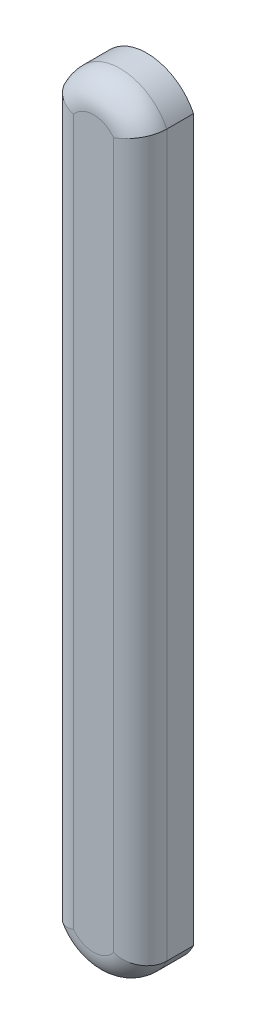
ISO-10303-21;
HEADER;
FILE_DESCRIPTION(('STEP AP214'),'2;1');
FILE_NAME('part.step','',(''),(''),'','','');
FILE_SCHEMA(('AUTOMOTIVE_DESIGN { 1 0 10303 214 1 1 1 1 }'));
ENDSEC;
DATA;
#1=APPLICATION_CONTEXT('core data for automotive mechanical design processes');
#2=APPLICATION_PROTOCOL_DEFINITION('international standard','automotive_design',2000,#1);
#3=PRODUCT_CONTEXT('',#1,'mechanical');
#4=PRODUCT('Part','Part','',(#3));
#5=PRODUCT_RELATED_PRODUCT_CATEGORY('part','',(#4));
#6=PRODUCT_DEFINITION_FORMATION('','',#4);
#7=PRODUCT_DEFINITION_CONTEXT('part definition',#1,'design');
#8=PRODUCT_DEFINITION('design','',#6,#7);
#9=PRODUCT_DEFINITION_SHAPE('','',#8);
#10=(LENGTH_UNIT() NAMED_UNIT(*) SI_UNIT(.MILLI.,.METRE.));
#11=(NAMED_UNIT(*) PLANE_ANGLE_UNIT() SI_UNIT($,.RADIAN.));
#12=(NAMED_UNIT(*) SI_UNIT($,.STERADIAN.) SOLID_ANGLE_UNIT());
#13=UNCERTAINTY_MEASURE_WITH_UNIT(LENGTH_MEASURE(1.E-05),#10,'distance_accuracy_value','');
#14=(GEOMETRIC_REPRESENTATION_CONTEXT(3) GLOBAL_UNCERTAINTY_ASSIGNED_CONTEXT((#13)) GLOBAL_UNIT_ASSIGNED_CONTEXT((#10,
#11,#12)) REPRESENTATION_CONTEXT('',''));
#15=CARTESIAN_POINT('',(0.,0.,0.));
#16=DIRECTION('',(0.,0.,1.));
#17=DIRECTION('',(1.,0.,0.));
#18=AXIS2_PLACEMENT_3D('',#15,#16,#17);
#19=CARTESIAN_POINT('',(0.175,0.0859698267459459,0.2));
#20=DIRECTION('',(0.,0.,-1.));
#21=DIRECTION('',(-1.,0.,0.));
#22=AXIS2_PLACEMENT_3D('',#19,#20,#21);
#23=CYLINDRICAL_SURFACE('',#22,0.194976437321867);
#24=DIRECTION('',(0.,0.,-1.));
#25=VECTOR('',#24,1.);
#26=CARTESIAN_POINT('',(0.35,0.,0.2));
#27=LINE('',#26,#25);
#28=CARTESIAN_POINT('',(0.35,0.,0.1));
#29=VERTEX_POINT('',#28);
#30=CARTESIAN_POINT('',(0.35,0.,0.));
#31=VERTEX_POINT('',#30);
#32=EDGE_CURVE('E92',#29,#31,#27,.T.);
#33=ORIENTED_EDGE('',*,*,#32,.F.);
#34=CARTESIAN_POINT('',(0.175,0.0859698267459459,0.1));
#35=DIRECTION('',(0.,0.,1.));
#36=DIRECTION('',(1.,0.,0.));
#37=AXIS2_PLACEMENT_3D('',#34,#35,#36);
#38=CIRCLE('',#37,0.194976437321867);
#39=CARTESIAN_POINT('',(0.,0.,0.1));
#40=VERTEX_POINT('',#39);
#41=EDGE_CURVE('E134',#29,#40,#38,.F.);
#42=ORIENTED_EDGE('',*,*,#41,.T.);
#43=DIRECTION('',(0.,0.,-1.));
#44=VECTOR('',#43,1.);
#45=CARTESIAN_POINT('',(0.,0.,0.2));
#46=LINE('',#45,#44);
#47=CARTESIAN_POINT('',(0.,0.,0.));
#48=VERTEX_POINT('',#47);
#49=EDGE_CURVE('E113',#40,#48,#46,.T.);
#50=ORIENTED_EDGE('',*,*,#49,.T.);
#51=CARTESIAN_POINT('',(0.175,0.0859698267459459,0.));
#52=DIRECTION('',(0.,0.,1.));
#53=DIRECTION('',(1.,0.,0.));
#54=AXIS2_PLACEMENT_3D('',#51,#52,#53);
#55=CIRCLE('',#54,0.194976437321867);
#56=EDGE_CURVE('E109',#48,#31,#55,.T.);
#57=ORIENTED_EDGE('',*,*,#56,.T.);
#58=EDGE_LOOP('',(#33,#42,#50,#57));
#59=FACE_BOUND('',#58,.T.);
#60=ADVANCED_FACE('F33',(#59),#23,.T.);
#61=CARTESIAN_POINT('',(0.35,0.,0.2));
#62=DIRECTION('',(-1.,0.,0.));
#63=DIRECTION('',(0.,0.,1.));
#64=AXIS2_PLACEMENT_3D('',#61,#62,#63);
#65=PLANE('',#64);
#66=DIRECTION('',(0.,0.,-1.));
#67=VECTOR('',#66,1.);
#68=CARTESIAN_POINT('',(0.35,2.7,0.2));
#69=LINE('',#68,#67);
#70=CARTESIAN_POINT('',(0.35,2.7,0.1));
#71=VERTEX_POINT('',#70);
#72=CARTESIAN_POINT('',(0.35,2.7,0.));
#73=VERTEX_POINT('',#72);
#74=EDGE_CURVE('E103',#71,#73,#69,.T.);
#75=ORIENTED_EDGE('',*,*,#74,.F.);
#76=DIRECTION('',(0.,1.,0.));
#77=VECTOR('',#76,1.);
#78=CARTESIAN_POINT('',(0.35,0.,0.1));
#79=LINE('',#78,#77);
#80=EDGE_CURVE('E47',#71,#29,#79,.F.);
#81=ORIENTED_EDGE('',*,*,#80,.T.);
#82=ORIENTED_EDGE('',*,*,#32,.T.);
#83=DIRECTION('',(0.,1.,0.));
#84=VECTOR('',#83,1.);
#85=CARTESIAN_POINT('',(0.35,0.,0.));
#86=LINE('',#85,#84);
#87=EDGE_CURVE('E95',#31,#73,#86,.T.);
#88=ORIENTED_EDGE('',*,*,#87,.T.);
#89=EDGE_LOOP('',(#75,#81,#82,#88));
#90=FACE_BOUND('',#89,.T.);
#91=ADVANCED_FACE('F94',(#90),#65,.F.);
#92=CARTESIAN_POINT('',(0.175,2.61403017325405,0.2));
#93=DIRECTION('',(0.,0.,-1.));
#94=DIRECTION('',(-1.,0.,0.));
#95=AXIS2_PLACEMENT_3D('',#92,#93,#94);
#96=CYLINDRICAL_SURFACE('',#95,0.194976437321867);
#97=DIRECTION('',(0.,0.,-1.));
#98=VECTOR('',#97,1.);
#99=CARTESIAN_POINT('',(0.,2.7,0.2));
#100=LINE('',#99,#98);
#101=CARTESIAN_POINT('',(0.,2.7,0.1));
#102=VERTEX_POINT('',#101);
#103=CARTESIAN_POINT('',(0.,2.7,0.));
#104=VERTEX_POINT('',#103);
#105=EDGE_CURVE('E123',#102,#104,#100,.T.);
#106=ORIENTED_EDGE('',*,*,#105,.F.);
#107=CARTESIAN_POINT('',(0.175,2.61403017325405,0.1));
#108=DIRECTION('',(0.,0.,1.));
#109=DIRECTION('',(1.,0.,0.));
#110=AXIS2_PLACEMENT_3D('',#107,#108,#109);
#111=CIRCLE('',#110,0.194976437321867);
#112=EDGE_CURVE('E11',#102,#71,#111,.F.);
#113=ORIENTED_EDGE('',*,*,#112,.T.);
#114=ORIENTED_EDGE('',*,*,#74,.T.);
#115=CARTESIAN_POINT('',(0.175,2.61403017325405,0.));
#116=DIRECTION('',(0.,0.,1.));
#117=DIRECTION('',(-1.,0.,0.));
#118=AXIS2_PLACEMENT_3D('',#115,#116,#117);
#119=CIRCLE('',#118,0.194976437321867);
#120=EDGE_CURVE('E111',#73,#104,#119,.T.);
#121=ORIENTED_EDGE('',*,*,#120,.T.);
#122=EDGE_LOOP('',(#106,#113,#114,#121));
#123=FACE_BOUND('',#122,.T.);
#124=ADVANCED_FACE('F176',(#123),#96,.T.);
#125=CARTESIAN_POINT('',(0.,0.,0.2));
#126=DIRECTION('',(1.,0.,0.));
#127=DIRECTION('',(0.,0.,-1.));
#128=AXIS2_PLACEMENT_3D('',#125,#126,#127);
#129=PLANE('',#128);
#130=ORIENTED_EDGE('',*,*,#49,.F.);
#131=DIRECTION('',(0.,-1.,0.));
#132=VECTOR('',#131,1.);
#133=CARTESIAN_POINT('',(0.,2.7,0.1));
#134=LINE('',#133,#132);
#135=EDGE_CURVE('E61',#40,#102,#134,.F.);
#136=ORIENTED_EDGE('',*,*,#135,.T.);
#137=ORIENTED_EDGE('',*,*,#105,.T.);
#138=DIRECTION('',(0.,-1.,0.));
#139=VECTOR('',#138,1.);
#140=CARTESIAN_POINT('',(0.,0.,0.));
#141=LINE('',#140,#139);
#142=EDGE_CURVE('E120',#104,#48,#141,.T.);
#143=ORIENTED_EDGE('',*,*,#142,.T.);
#144=EDGE_LOOP('',(#130,#136,#137,#143));
#145=FACE_BOUND('',#144,.T.);
#146=ADVANCED_FACE('F175',(#145),#129,.F.);
#147=CARTESIAN_POINT('',(0.175,0.0859698267459459,0.2));
#148=DIRECTION('',(0.,0.,1.));
#149=DIRECTION('',(1.,0.,0.));
#150=AXIS2_PLACEMENT_3D('',#147,#148,#149);
#151=PLANE('',#150);
#152=DIRECTION('',(0.,-1.,0.));
#153=VECTOR('',#152,1.);
#154=CARTESIAN_POINT('',(0.1,0.,0.2));
#155=LINE('',#154,#153);
#156=CARTESIAN_POINT('',(0.100000000000006,2.67230129514437,0.2));
#157=VERTEX_POINT('',#156);
#158=CARTESIAN_POINT('',(0.1,0.0276987048556349,0.2));
#159=VERTEX_POINT('',#158);
#160=EDGE_CURVE('E129',#157,#159,#155,.T.);
#161=ORIENTED_EDGE('',*,*,#160,.T.);
#162=CARTESIAN_POINT('',(0.175,0.0859698267459459,0.2));
#163=DIRECTION('',(0.,0.,1.));
#164=DIRECTION('',(1.,0.,0.));
#165=AXIS2_PLACEMENT_3D('',#162,#163,#164);
#166=CIRCLE('',#165,0.0949764373218671);
#167=CARTESIAN_POINT('',(0.25,0.0276987048556348,0.2));
#168=VERTEX_POINT('',#167);
#169=EDGE_CURVE('E131',#159,#168,#166,.T.);
#170=ORIENTED_EDGE('',*,*,#169,.T.);
#171=DIRECTION('',(0.,1.,0.));
#172=VECTOR('',#171,1.);
#173=CARTESIAN_POINT('',(0.25,2.7,0.2));
#174=LINE('',#173,#172);
#175=CARTESIAN_POINT('',(0.249999999999994,2.67230129514437,0.2));
#176=VERTEX_POINT('',#175);
#177=EDGE_CURVE('E127',#168,#176,#174,.T.);
#178=ORIENTED_EDGE('',*,*,#177,.T.);
#179=CARTESIAN_POINT('',(0.175,2.61403017325405,0.2));
#180=DIRECTION('',(0.,0.,1.));
#181=DIRECTION('',(1.,0.,0.));
#182=AXIS2_PLACEMENT_3D('',#179,#180,#181);
#183=CIRCLE('',#182,0.0949764373218671);
#184=EDGE_CURVE('E102',#176,#157,#183,.T.);
#185=ORIENTED_EDGE('',*,*,#184,.T.);
#186=EDGE_LOOP('',(#161,#170,#178,#185));
#187=FACE_BOUND('',#186,.T.);
#188=ADVANCED_FACE('F180',(#187),#151,.T.);
#189=CARTESIAN_POINT('',(0.175,0.0859698267459459,0.));
#190=DIRECTION('',(0.,0.,1.));
#191=DIRECTION('',(1.,0.,0.));
#192=AXIS2_PLACEMENT_3D('',#189,#190,#191);
#193=PLANE('',#192);
#194=ORIENTED_EDGE('',*,*,#56,.F.);
#195=ORIENTED_EDGE('',*,*,#142,.F.);
#196=ORIENTED_EDGE('',*,*,#120,.F.);
#197=ORIENTED_EDGE('',*,*,#87,.F.);
#198=EDGE_LOOP('',(#194,#195,#196,#197));
#199=FACE_BOUND('',#198,.T.);
#200=ADVANCED_FACE('F107',(#199),#193,.F.);
#201=CARTESIAN_POINT('',(0.175,2.61403017325405,0.1));
#202=DIRECTION('',(0.,0.,1.));
#203=DIRECTION('',(1.,0.,0.));
#204=AXIS2_PLACEMENT_3D('',#201,#202,#203);
#205=DEGENERATE_TOROIDAL_SURFACE('',#204,0.0949764373218671,0.1,.T.);
#206=CARTESIAN_POINT('',(0.35,2.7,0.1));
#207=CARTESIAN_POINT('',(0.350005268670267,2.70000040754592,0.105511252154056));
#208=CARTESIAN_POINT('',(0.349544726083473,2.69989418803524,0.111020433796739));
#209=CARTESIAN_POINT('',(0.347731528858172,2.69947173953325,0.121874551323155));
#210=CARTESIAN_POINT('',(0.346380049196348,2.69915578713593,0.127219693839957));
#211=CARTESIAN_POINT('',(0.342823791248484,2.69831698281915,0.137602422816504));
#212=CARTESIAN_POINT('',(0.340618769337371,2.6977940718269,0.142639920990146));
#213=CARTESIAN_POINT('',(0.335428566635515,2.69654702816146,0.152267062418119));
#214=CARTESIAN_POINT('',(0.332443445191162,2.69582291079487,0.156856739704144));
#215=CARTESIAN_POINT('',(0.325756614399063,2.69417319123095,0.165506423196409));
#216=CARTESIAN_POINT('',(0.322048708236536,2.69324583736037,0.169561300463762));
#217=CARTESIAN_POINT('',(0.314048358880856,2.69120195336536,0.176991039421652));
#218=CARTESIAN_POINT('',(0.309755728604854,2.69008536266644,0.18036568261043));
#219=CARTESIAN_POINT('',(0.300608968757441,2.6876441832273,0.186426554884238));
#220=CARTESIAN_POINT('',(0.295743946563813,2.68631529375002,0.189094582015617));
#221=CARTESIAN_POINT('',(0.285685701853069,2.68347998727226,0.193577836216799));
#222=CARTESIAN_POINT('',(0.280492611405467,2.68197364150132,0.195393404007875));
#223=CARTESIAN_POINT('',(0.271464682749297,2.67925574089153,0.197746196020681));
#224=CARTESIAN_POINT('',(0.267672328405756,2.67808525366685,0.198501401199194));
#225=CARTESIAN_POINT('',(0.260055477527481,2.67566401718499,0.199567195235984));
#226=CARTESIAN_POINT('',(0.25623103898922,2.67441339335639,0.199878461996797));
#227=CARTESIAN_POINT('',(0.251610866919886,2.67285157075458,0.199990299901761));
#228=CARTESIAN_POINT('',(0.250805058561448,2.67257728559771,0.200000031817378));
#229=CARTESIAN_POINT('',(0.25,2.67230129514436,0.2));
#230=B_SPLINE_CURVE_WITH_KNOTS('',3,(#206,#207,#208,#209,#210,#211,#212,#213,#214,#215,#216,
#217,#218,#219,#220,#221,#222,#223,#224,#225,#226,#227,#228,#229),.UNSPECIFIED.,.F.,.F.,(4,2,2,
2,2,2,2,2,2,2,2,4),(0.,0.0165104363716612,0.0329991420587914,0.04949255756284,
0.0659847186886619,0.0826250435228636,0.0992707050000556,0.116310692768043,0.133343863977416,
0.145441145514401,0.157519934417857,0.160073462740983),.UNSPECIFIED.);
#231=EDGE_CURVE('E117',#71,#176,#230,.T.);
#232=ORIENTED_EDGE('',*,*,#231,.F.);
#233=ORIENTED_EDGE('',*,*,#112,.F.);
#234=CARTESIAN_POINT('',(0.,2.7,0.1));
#235=CARTESIAN_POINT('',(-5.26867026747192E-06,2.70000040754592,0.105511252154056));
#236=CARTESIAN_POINT('',(0.00045527391652668,2.69989418803524,0.111020433796739));
#237=CARTESIAN_POINT('',(0.0022684711418276,2.69947173953325,0.121874551323155));
#238=CARTESIAN_POINT('',(0.0036199508036519,2.69915578713593,0.127219693839957));
#239=CARTESIAN_POINT('',(0.00717620875151554,2.69831698281915,0.137602422816504));
#240=CARTESIAN_POINT('',(0.00938123066262875,2.6977940718269,0.142639920990146));
#241=CARTESIAN_POINT('',(0.0145714333644852,2.69654702816146,0.152267062418119));
#242=CARTESIAN_POINT('',(0.0175565548088385,2.69582291079487,0.156856739704144));
#243=CARTESIAN_POINT('',(0.0242433856009374,2.69417319123095,0.165506423196409));
#244=CARTESIAN_POINT('',(0.0279512917634644,2.69324583736037,0.169561300463762));
#245=CARTESIAN_POINT('',(0.0359516411191435,2.69120195336536,0.176991039421652));
#246=CARTESIAN_POINT('',(0.0402442713951461,2.69008536266644,0.18036568261043));
#247=CARTESIAN_POINT('',(0.0493910312425593,2.6876441832273,0.186426554884238));
#248=CARTESIAN_POINT('',(0.0542560534361865,2.68631529375002,0.189094582015617));
#249=CARTESIAN_POINT('',(0.0643142981469309,2.68347998727226,0.193577836216799));
#250=CARTESIAN_POINT('',(0.0695073885945331,2.68197364150132,0.195393404007875));
#251=CARTESIAN_POINT('',(0.078535317250703,2.67925574089153,0.197746196020681));
#252=CARTESIAN_POINT('',(0.0823276715942446,2.67808525366685,0.198501401199194));
#253=CARTESIAN_POINT('',(0.089944522472519,2.67566401718499,0.199567195235984));
#254=CARTESIAN_POINT('',(0.0937689610107797,2.67441339335639,0.199878461996796));
#255=CARTESIAN_POINT('',(0.0983891330801133,2.67285157075458,0.199990299901761));
#256=CARTESIAN_POINT('',(0.0991949414385524,2.67257728559771,0.200000031817378));
#257=CARTESIAN_POINT('',(0.1,2.67230129514436,0.2));
#258=B_SPLINE_CURVE_WITH_KNOTS('',3,(#234,#235,#236,#237,#238,#239,#240,#241,#242,#243,#244,
#245,#246,#247,#248,#249,#250,#251,#252,#253,#254,#255,#256,#257),.UNSPECIFIED.,.F.,.F.,(4,2,2,
2,2,2,2,2,2,2,2,4),(0.,0.0165104363716612,0.0329991420587914,0.0494925575628399,
0.0659847186886619,0.0826250435228635,0.0992707050000553,0.116310692768043,0.133343863977416,
0.145441145514401,0.157519934417857,0.160073462740983),.UNSPECIFIED.);
#259=EDGE_CURVE('E38',#157,#102,#258,.F.);
#260=ORIENTED_EDGE('',*,*,#259,.F.);
#261=ORIENTED_EDGE('',*,*,#184,.F.);
#262=EDGE_LOOP('',(#232,#233,#260,#261));
#263=FACE_BOUND('',#262,.T.);
#264=ADVANCED_FACE('F35',(#263),#205,.T.);
#265=CARTESIAN_POINT('',(0.1,0.0859698267459459,0.1));
#266=DIRECTION('',(0.,1.,0.));
#267=DIRECTION('',(0.,0.,1.));
#268=AXIS2_PLACEMENT_3D('',#265,#266,#267);
#269=CYLINDRICAL_SURFACE('',#268,0.1);
#270=ORIENTED_EDGE('',*,*,#259,.T.);
#271=ORIENTED_EDGE('',*,*,#135,.F.);
#272=CARTESIAN_POINT('',(0.,0.,0.1));
#273=CARTESIAN_POINT('',(-5.26867026748236E-06,-4.07545918015375E-07,0.105511252154056));
#274=CARTESIAN_POINT('',(0.000455273916526669,0.000105811964755518,0.111020433796739));
#275=CARTESIAN_POINT('',(0.00226847114182761,0.000528260466754694,0.121874551323155));
#276=CARTESIAN_POINT('',(0.00361995080365192,0.000844212864070144,0.127219693839957));
#277=CARTESIAN_POINT('',(0.00717620875151555,0.00168301718085015,0.137602422816504));
#278=CARTESIAN_POINT('',(0.00938123066262875,0.00220592817310278,0.142639920990146));
#279=CARTESIAN_POINT('',(0.0145714333644852,0.00345297183853691,0.152267062418119));
#280=CARTESIAN_POINT('',(0.0175565548088385,0.00417708920512647,0.156856739704144));
#281=CARTESIAN_POINT('',(0.0242433856009374,0.0058268087690542,0.165506423196409));
#282=CARTESIAN_POINT('',(0.0279512917634644,0.00675416263962729,0.169561300463762));
#283=CARTESIAN_POINT('',(0.0359516411191436,0.00879804663464382,0.176991039421652));
#284=CARTESIAN_POINT('',(0.0402442713951461,0.00991463733356412,0.18036568261043));
#285=CARTESIAN_POINT('',(0.0493910312425594,0.0123558167727032,0.186426554884238));
#286=CARTESIAN_POINT('',(0.0542560534361864,0.0136847062499834,0.189094582015616));
#287=CARTESIAN_POINT('',(0.0643142981469308,0.0165200127277397,0.193577836216799));
#288=CARTESIAN_POINT('',(0.0695073885945331,0.0180263584986783,0.195393404007875));
#289=CARTESIAN_POINT('',(0.078535317250703,0.0207442591084679,0.197746196020681));
#290=CARTESIAN_POINT('',(0.0823276715942445,0.0219147463331537,0.198501401199194));
#291=CARTESIAN_POINT('',(0.089944522472519,0.0243359828150114,0.199567195235984));
#292=CARTESIAN_POINT('',(0.0937689610107799,0.025586606643607,0.199878461996796));
#293=CARTESIAN_POINT('',(0.0983891330801134,0.0271484292454211,0.199990299901761));
#294=CARTESIAN_POINT('',(0.0991949414385524,0.0274227144022899,0.200000031817378));
#295=CARTESIAN_POINT('',(0.1,0.027698704855643,0.2));
#296=B_SPLINE_CURVE_WITH_KNOTS('',3,(#272,#273,#274,#275,#276,#277,#278,#279,#280,#281,#282,
#283,#284,#285,#286,#287,#288,#289,#290,#291,#292,#293,#294,#295),.UNSPECIFIED.,.F.,.F.,(4,2,2,
2,2,2,2,2,2,2,2,4),(0.,0.0165104363716612,0.0329991420587914,0.0494925575628399,
0.0659847186886619,0.0826250435228636,0.0992707050000554,0.116310692768043,0.133343863977416,
0.145441145514401,0.157519934417857,0.160073462740983),.UNSPECIFIED.);
#297=EDGE_CURVE('E146',#159,#40,#296,.F.);
#298=ORIENTED_EDGE('',*,*,#297,.F.);
#299=ORIENTED_EDGE('',*,*,#160,.F.);
#300=EDGE_LOOP('',(#270,#271,#298,#299));
#301=FACE_BOUND('',#300,.T.);
#302=ADVANCED_FACE('F157',(#301),#269,.T.);
#303=CARTESIAN_POINT('',(0.25,0.0859698267459459,0.1));
#304=DIRECTION('',(0.,-1.,0.));
#305=DIRECTION('',(0.,0.,-1.));
#306=AXIS2_PLACEMENT_3D('',#303,#304,#305);
#307=CYLINDRICAL_SURFACE('',#306,0.1);
#308=ORIENTED_EDGE('',*,*,#231,.T.);
#309=ORIENTED_EDGE('',*,*,#177,.F.);
#310=CARTESIAN_POINT('',(0.35,0.,0.1));
#311=CARTESIAN_POINT('',(0.350005268670267,-4.07545918076036E-07,0.105511252154056));
#312=CARTESIAN_POINT('',(0.349544726083473,0.000105811964755432,0.111020433796739));
#313=CARTESIAN_POINT('',(0.347731528858172,0.000528260466754578,0.121874551323155));
#314=CARTESIAN_POINT('',(0.346380049196348,0.000844212864070024,0.127219693839957));
#315=CARTESIAN_POINT('',(0.342823791248484,0.00168301718085,0.137602422816504));
#316=CARTESIAN_POINT('',(0.340618769337371,0.00220592817310261,0.142639920990146));
#317=CARTESIAN_POINT('',(0.335428566635515,0.00345297183853675,0.152267062418119));
#318=CARTESIAN_POINT('',(0.332443445191162,0.00417708920512633,0.156856739704144));
#319=CARTESIAN_POINT('',(0.325756614399063,0.00582680876905407,0.165506423196409));
#320=CARTESIAN_POINT('',(0.322048708236536,0.00675416263962716,0.169561300463762));
#321=CARTESIAN_POINT('',(0.314048358880856,0.00879804663464371,0.176991039421652));
#322=CARTESIAN_POINT('',(0.309755728604854,0.00991463733356404,0.18036568261043));
#323=CARTESIAN_POINT('',(0.300608968757441,0.0123558167727031,0.186426554884238));
#324=CARTESIAN_POINT('',(0.295743946563814,0.0136847062499834,0.189094582015616));
#325=CARTESIAN_POINT('',(0.285685701853069,0.0165200127277395,0.193577836216799));
#326=CARTESIAN_POINT('',(0.280492611405467,0.0180263584986779,0.195393404007875));
#327=CARTESIAN_POINT('',(0.271464682749297,0.0207442591084677,0.197746196020681));
#328=CARTESIAN_POINT('',(0.267672328405756,0.0219147463331537,0.198501401199194));
#329=CARTESIAN_POINT('',(0.260055477527481,0.0243359828150113,0.199567195235984));
#330=CARTESIAN_POINT('',(0.25623103898922,0.0255866066436064,0.199878461996796));
#331=CARTESIAN_POINT('',(0.251610866919886,0.0271484292454208,0.199990299901761));
#332=CARTESIAN_POINT('',(0.250805058561448,0.0274227144022896,0.200000031817378));
#333=CARTESIAN_POINT('',(0.25,0.0276987048556429,0.2));
#334=B_SPLINE_CURVE_WITH_KNOTS('',3,(#310,#311,#312,#313,#314,#315,#316,#317,#318,#319,#320,
#321,#322,#323,#324,#325,#326,#327,#328,#329,#330,#331,#332,#333),.UNSPECIFIED.,.F.,.F.,(4,2,2,
2,2,2,2,2,2,2,2,4),(0.,0.0165104363716612,0.0329991420587914,0.0494925575628399,
0.0659847186886618,0.0826250435228637,0.0992707050000554,0.116310692768043,0.133343863977416,
0.145441145514401,0.157519934417857,0.160073462740983),.UNSPECIFIED.);
#335=EDGE_CURVE('E138',#29,#168,#334,.T.);
#336=ORIENTED_EDGE('',*,*,#335,.F.);
#337=ORIENTED_EDGE('',*,*,#80,.F.);
#338=EDGE_LOOP('',(#308,#309,#336,#337));
#339=FACE_BOUND('',#338,.T.);
#340=ADVANCED_FACE('F154',(#339),#307,.T.);
#341=CARTESIAN_POINT('',(0.175,0.0859698267459459,0.1));
#342=DIRECTION('',(0.,0.,1.));
#343=DIRECTION('',(1.,0.,0.));
#344=AXIS2_PLACEMENT_3D('',#341,#342,#343);
#345=DEGENERATE_TOROIDAL_SURFACE('',#344,0.0949764373218671,0.1,.T.);
#346=ORIENTED_EDGE('',*,*,#297,.T.);
#347=ORIENTED_EDGE('',*,*,#41,.F.);
#348=ORIENTED_EDGE('',*,*,#335,.T.);
#349=ORIENTED_EDGE('',*,*,#169,.F.);
#350=EDGE_LOOP('',(#346,#347,#348,#349));
#351=FACE_BOUND('',#350,.T.);
#352=ADVANCED_FACE('F151',(#351),#345,.T.);
#353=CLOSED_SHELL('',(#60,#91,#124,#146,#188,#200,#264,#302,#340,#352));
#354=MANIFOLD_SOLID_BREP('B2',#353);
#355=ADVANCED_BREP_SHAPE_REPRESENTATION('',(#18,#354),#14);
#356=SHAPE_DEFINITION_REPRESENTATION(#9,#355);
ENDSEC;
END-ISO-10303-21;
